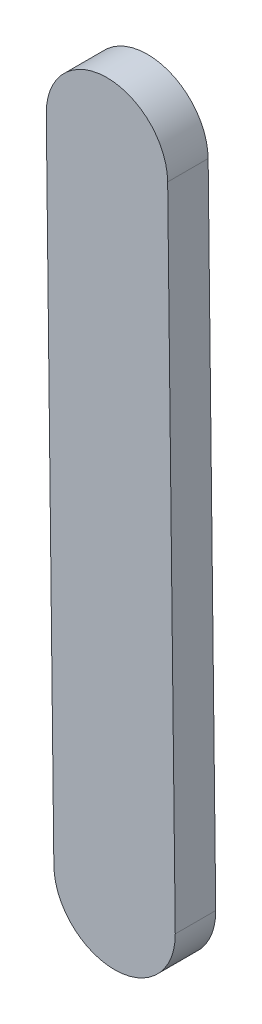
ISO-10303-21;
HEADER;
FILE_DESCRIPTION(('STEP AP214'),'2;1');
FILE_NAME('part.step','',(''),(''),'','','');
FILE_SCHEMA(('AUTOMOTIVE_DESIGN { 1 0 10303 214 1 1 1 1 }'));
ENDSEC;
DATA;
#1=APPLICATION_CONTEXT('core data for automotive mechanical design processes');
#2=APPLICATION_PROTOCOL_DEFINITION('international standard','automotive_design',2000,#1);
#3=PRODUCT_CONTEXT('',#1,'mechanical');
#4=PRODUCT('Part','Part','',(#3));
#5=PRODUCT_RELATED_PRODUCT_CATEGORY('part','',(#4));
#6=PRODUCT_DEFINITION_FORMATION('','',#4);
#7=PRODUCT_DEFINITION_CONTEXT('part definition',#1,'design');
#8=PRODUCT_DEFINITION('design','',#6,#7);
#9=PRODUCT_DEFINITION_SHAPE('','',#8);
#10=(LENGTH_UNIT() NAMED_UNIT(*) SI_UNIT(.MILLI.,.METRE.));
#11=(NAMED_UNIT(*) PLANE_ANGLE_UNIT() SI_UNIT($,.RADIAN.));
#12=(NAMED_UNIT(*) SI_UNIT($,.STERADIAN.) SOLID_ANGLE_UNIT());
#13=UNCERTAINTY_MEASURE_WITH_UNIT(LENGTH_MEASURE(1.E-05),#10,'distance_accuracy_value','');
#14=(GEOMETRIC_REPRESENTATION_CONTEXT(3) GLOBAL_UNCERTAINTY_ASSIGNED_CONTEXT((#13)) GLOBAL_UNIT_ASSIGNED_CONTEXT((#10,
#11,#12)) REPRESENTATION_CONTEXT('',''));
#15=CARTESIAN_POINT('',(0.,0.,0.));
#16=DIRECTION('',(0.,0.,1.));
#17=DIRECTION('',(1.,0.,0.));
#18=AXIS2_PLACEMENT_3D('',#15,#16,#17);
#19=CARTESIAN_POINT('',(-31.28418842541,61.4662238710629,1.));
#20=DIRECTION('',(0.,0.,-1.));
#21=DIRECTION('',(-1.,0.,0.));
#22=AXIS2_PLACEMENT_3D('',#19,#20,#21);
#23=CYLINDRICAL_SURFACE('',#22,1.5);
#24=CARTESIAN_POINT('',(-31.28418842541,61.4662238710629,0.));
#25=DIRECTION('',(0.,0.,1.));
#26=DIRECTION('',(1.,0.,0.));
#27=AXIS2_PLACEMENT_3D('',#24,#25,#26);
#28=CIRCLE('',#27,1.5);
#29=CARTESIAN_POINT('',(-29.784291411629,61.4838007891932,0.));
#30=VERTEX_POINT('',#29);
#31=CARTESIAN_POINT('',(-32.784085439191,61.4486469529327,0.));
#32=VERTEX_POINT('',#31);
#33=EDGE_CURVE('E102',#30,#32,#28,.T.);
#34=ORIENTED_EDGE('',*,*,#33,.T.);
#35=DIRECTION('',(0.,0.,-1.));
#36=VECTOR('',#35,1.);
#37=CARTESIAN_POINT('',(-32.784085439191,61.4486469529327,1.));
#38=LINE('',#37,#36);
#39=CARTESIAN_POINT('',(-32.784085439191,61.4486469529327,1.));
#40=VERTEX_POINT('',#39);
#41=EDGE_CURVE('E11',#40,#32,#38,.T.);
#42=ORIENTED_EDGE('',*,*,#41,.F.);
#43=CARTESIAN_POINT('',(-31.28418842541,61.4662238710629,1.));
#44=DIRECTION('',(0.,0.,1.));
#45=DIRECTION('',(1.,0.,0.));
#46=AXIS2_PLACEMENT_3D('',#43,#44,#45);
#47=CIRCLE('',#46,1.5);
#48=CARTESIAN_POINT('',(-29.784291411629,61.4838007891932,1.));
#49=VERTEX_POINT('',#48);
#50=EDGE_CURVE('E90',#49,#40,#47,.T.);
#51=ORIENTED_EDGE('',*,*,#50,.F.);
#52=DIRECTION('',(0.,0.,-1.));
#53=VECTOR('',#52,1.);
#54=CARTESIAN_POINT('',(-29.784291411629,61.4838007891932,1.));
#55=LINE('',#54,#53);
#56=EDGE_CURVE('E98',#49,#30,#55,.T.);
#57=ORIENTED_EDGE('',*,*,#56,.T.);
#58=EDGE_LOOP('',(#34,#42,#51,#57));
#59=FACE_BOUND('',#58,.T.);
#60=ADVANCED_FACE('F39',(#59),#23,.T.);
#61=CARTESIAN_POINT('',(-32.784085439191,61.4486469529327,1.));
#62=DIRECTION('',(0.99993134252064,0.0117179454201641,0.));
#63=DIRECTION('',(-0.0117179454201641,0.99993134252064,0.));
#64=AXIS2_PLACEMENT_3D('',#61,#62,#63);
#65=PLANE('',#64);
#66=DIRECTION('',(0.0117179454201641,-0.999931342520641,0.));
#67=VECTOR('',#66,1.);
#68=CARTESIAN_POINT('',(-32.784085439191,61.4486469529327,0.));
#69=LINE('',#68,#67);
#70=CARTESIAN_POINT('',(-32.5965983124683,45.4497454726025,0.));
#71=VERTEX_POINT('',#70);
#72=EDGE_CURVE('E94',#32,#71,#69,.T.);
#73=ORIENTED_EDGE('',*,*,#72,.T.);
#74=DIRECTION('',(0.,0.,-1.));
#75=VECTOR('',#74,1.);
#76=CARTESIAN_POINT('',(-32.5965983124683,45.4497454726025,1.));
#77=LINE('',#76,#75);
#78=CARTESIAN_POINT('',(-32.5965983124683,45.4497454726025,1.));
#79=VERTEX_POINT('',#78);
#80=EDGE_CURVE('E47',#79,#71,#77,.T.);
#81=ORIENTED_EDGE('',*,*,#80,.F.);
#82=DIRECTION('',(0.0117179454201641,-0.999931342520641,0.));
#83=VECTOR('',#82,1.);
#84=CARTESIAN_POINT('',(-32.784085439191,61.4486469529327,1.));
#85=LINE('',#84,#83);
#86=EDGE_CURVE('E85',#40,#79,#85,.T.);
#87=ORIENTED_EDGE('',*,*,#86,.F.);
#88=ORIENTED_EDGE('',*,*,#41,.T.);
#89=EDGE_LOOP('',(#73,#81,#87,#88));
#90=FACE_BOUND('',#89,.T.);
#91=ADVANCED_FACE('F93',(#90),#65,.F.);
#92=CARTESIAN_POINT('',(-31.0967012986874,45.4673223907327,1.));
#93=DIRECTION('',(0.,0.,-1.));
#94=DIRECTION('',(-1.,0.,0.));
#95=AXIS2_PLACEMENT_3D('',#92,#93,#94);
#96=CYLINDRICAL_SURFACE('',#95,1.5);
#97=CARTESIAN_POINT('',(-31.0967012986874,45.4673223907327,0.));
#98=DIRECTION('',(0.,0.,1.));
#99=DIRECTION('',(1.,0.,0.));
#100=AXIS2_PLACEMENT_3D('',#97,#98,#99);
#101=CIRCLE('',#100,1.5);
#102=CARTESIAN_POINT('',(-29.5968042849064,45.4848993088629,0.));
#103=VERTEX_POINT('',#102);
#104=EDGE_CURVE('E72',#71,#103,#101,.T.);
#105=ORIENTED_EDGE('',*,*,#104,.T.);
#106=DIRECTION('',(0.,0.,-1.));
#107=VECTOR('',#106,1.);
#108=CARTESIAN_POINT('',(-29.5968042849064,45.4848993088629,1.));
#109=LINE('',#108,#107);
#110=CARTESIAN_POINT('',(-29.5968042849064,45.4848993088629,1.));
#111=VERTEX_POINT('',#110);
#112=EDGE_CURVE('E95',#111,#103,#109,.T.);
#113=ORIENTED_EDGE('',*,*,#112,.F.);
#114=CARTESIAN_POINT('',(-31.0967012986874,45.4673223907327,1.));
#115=DIRECTION('',(0.,0.,1.));
#116=DIRECTION('',(1.,0.,0.));
#117=AXIS2_PLACEMENT_3D('',#114,#115,#116);
#118=CIRCLE('',#117,1.5);
#119=EDGE_CURVE('E88',#79,#111,#118,.T.);
#120=ORIENTED_EDGE('',*,*,#119,.F.);
#121=ORIENTED_EDGE('',*,*,#80,.T.);
#122=EDGE_LOOP('',(#105,#113,#120,#121));
#123=FACE_BOUND('',#122,.T.);
#124=ADVANCED_FACE('F96',(#123),#96,.T.);
#125=CARTESIAN_POINT('',(-29.784291411629,61.4838007891932,1.));
#126=DIRECTION('',(-0.99993134252064,-0.0117179454201641,0.));
#127=DIRECTION('',(0.0117179454201641,-0.99993134252064,0.));
#128=AXIS2_PLACEMENT_3D('',#125,#126,#127);
#129=PLANE('',#128);
#130=DIRECTION('',(-0.0117179454201641,0.99993134252064,0.));
#131=VECTOR('',#130,1.);
#132=CARTESIAN_POINT('',(-29.784291411629,61.4838007891932,0.));
#133=LINE('',#132,#131);
#134=EDGE_CURVE('E78',#103,#30,#133,.T.);
#135=ORIENTED_EDGE('',*,*,#134,.T.);
#136=ORIENTED_EDGE('',*,*,#56,.F.);
#137=DIRECTION('',(-0.0117179454201641,0.99993134252064,0.));
#138=VECTOR('',#137,1.);
#139=CARTESIAN_POINT('',(-29.784291411629,61.4838007891932,1.));
#140=LINE('',#139,#138);
#141=EDGE_CURVE('E55',#111,#49,#140,.T.);
#142=ORIENTED_EDGE('',*,*,#141,.F.);
#143=ORIENTED_EDGE('',*,*,#112,.T.);
#144=EDGE_LOOP('',(#135,#136,#142,#143));
#145=FACE_BOUND('',#144,.T.);
#146=ADVANCED_FACE('F109',(#145),#129,.F.);
#147=CARTESIAN_POINT('',(-31.28418842541,61.4662238710629,1.));
#148=DIRECTION('',(0.,0.,1.));
#149=DIRECTION('',(1.,0.,0.));
#150=AXIS2_PLACEMENT_3D('',#147,#148,#149);
#151=PLANE('',#150);
#152=ORIENTED_EDGE('',*,*,#50,.T.);
#153=ORIENTED_EDGE('',*,*,#86,.T.);
#154=ORIENTED_EDGE('',*,*,#119,.T.);
#155=ORIENTED_EDGE('',*,*,#141,.T.);
#156=EDGE_LOOP('',(#152,#153,#154,#155));
#157=FACE_BOUND('',#156,.T.);
#158=ADVANCED_FACE('F86',(#157),#151,.T.);
#159=CARTESIAN_POINT('',(-31.28418842541,61.4662238710629,0.));
#160=DIRECTION('',(0.,0.,1.));
#161=DIRECTION('',(1.,0.,0.));
#162=AXIS2_PLACEMENT_3D('',#159,#160,#161);
#163=PLANE('',#162);
#164=ORIENTED_EDGE('',*,*,#33,.F.);
#165=ORIENTED_EDGE('',*,*,#134,.F.);
#166=ORIENTED_EDGE('',*,*,#104,.F.);
#167=ORIENTED_EDGE('',*,*,#72,.F.);
#168=EDGE_LOOP('',(#164,#165,#166,#167));
#169=FACE_BOUND('',#168,.T.);
#170=ADVANCED_FACE('F112',(#169),#163,.F.);
#171=CLOSED_SHELL('',(#60,#91,#124,#146,#158,#170));
#172=MANIFOLD_SOLID_BREP('B2',#171);
#173=ADVANCED_BREP_SHAPE_REPRESENTATION('',(#18,#172),#14);
#174=SHAPE_DEFINITION_REPRESENTATION(#9,#173);
ENDSEC;
END-ISO-10303-21;
